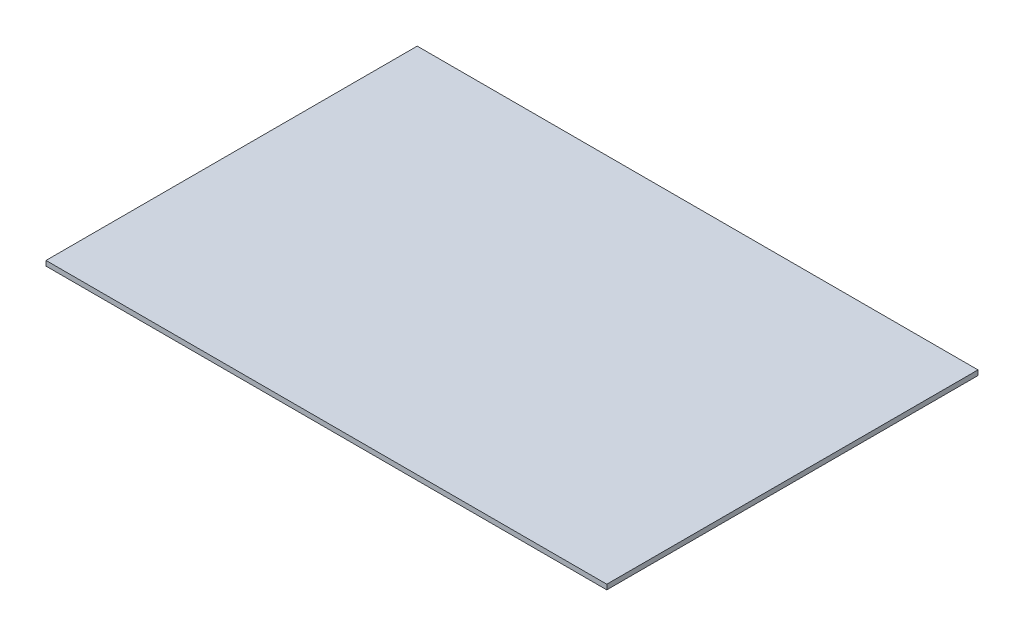
ISO-10303-21;
HEADER;
FILE_DESCRIPTION(('STEP AP214'),'2;1');
FILE_NAME('part.step','',(''),(''),'','','');
FILE_SCHEMA(('AUTOMOTIVE_DESIGN { 1 0 10303 214 1 1 1 1 }'));
ENDSEC;
DATA;
#1=APPLICATION_CONTEXT('core data for automotive mechanical design processes');
#2=APPLICATION_PROTOCOL_DEFINITION('international standard','automotive_design',2000,#1);
#3=PRODUCT_CONTEXT('',#1,'mechanical');
#4=PRODUCT('Part','Part','',(#3));
#5=PRODUCT_RELATED_PRODUCT_CATEGORY('part','',(#4));
#6=PRODUCT_DEFINITION_FORMATION('','',#4);
#7=PRODUCT_DEFINITION_CONTEXT('part definition',#1,'design');
#8=PRODUCT_DEFINITION('design','',#6,#7);
#9=PRODUCT_DEFINITION_SHAPE('','',#8);
#10=(LENGTH_UNIT() NAMED_UNIT(*) SI_UNIT(.MILLI.,.METRE.));
#11=(NAMED_UNIT(*) PLANE_ANGLE_UNIT() SI_UNIT($,.RADIAN.));
#12=(NAMED_UNIT(*) SI_UNIT($,.STERADIAN.) SOLID_ANGLE_UNIT());
#13=UNCERTAINTY_MEASURE_WITH_UNIT(LENGTH_MEASURE(1.E-05),#10,'distance_accuracy_value','');
#14=(GEOMETRIC_REPRESENTATION_CONTEXT(3) GLOBAL_UNCERTAINTY_ASSIGNED_CONTEXT((#13)) GLOBAL_UNIT_ASSIGNED_CONTEXT((#10,
#11,#12)) REPRESENTATION_CONTEXT('',''));
#15=CARTESIAN_POINT('',(0.,0.,0.));
#16=DIRECTION('',(0.,0.,1.));
#17=DIRECTION('',(1.,0.,0.));
#18=AXIS2_PLACEMENT_3D('',#15,#16,#17);
#19=CARTESIAN_POINT('',(0.,7.9375,0.));
#20=DIRECTION('',(1.,0.,0.));
#21=DIRECTION('',(0.,0.,-1.));
#22=AXIS2_PLACEMENT_3D('',#19,#20,#21);
#23=PLANE('',#22);
#24=DIRECTION('',(0.,0.,1.));
#25=VECTOR('',#24,1.);
#26=CARTESIAN_POINT('',(0.,0.,0.));
#27=LINE('',#26,#25);
#28=CARTESIAN_POINT('',(0.,0.,-596.9));
#29=VERTEX_POINT('',#28);
#30=CARTESIAN_POINT('',(0.,0.,0.));
#31=VERTEX_POINT('',#30);
#32=EDGE_CURVE('E97',#29,#31,#27,.T.);
#33=ORIENTED_EDGE('',*,*,#32,.T.);
#34=DIRECTION('',(0.,-1.,0.));
#35=VECTOR('',#34,1.);
#36=CARTESIAN_POINT('',(0.,7.9375,0.));
#37=LINE('',#36,#35);
#38=CARTESIAN_POINT('',(0.,7.9375,0.));
#39=VERTEX_POINT('',#38);
#40=EDGE_CURVE('E11',#39,#31,#37,.T.);
#41=ORIENTED_EDGE('',*,*,#40,.F.);
#42=DIRECTION('',(0.,0.,1.));
#43=VECTOR('',#42,1.);
#44=CARTESIAN_POINT('',(0.,7.9375,0.));
#45=LINE('',#44,#43);
#46=CARTESIAN_POINT('',(0.,7.9375,-596.9));
#47=VERTEX_POINT('',#46);
#48=EDGE_CURVE('E85',#47,#39,#45,.T.);
#49=ORIENTED_EDGE('',*,*,#48,.F.);
#50=DIRECTION('',(0.,-1.,0.));
#51=VECTOR('',#50,1.);
#52=CARTESIAN_POINT('',(0.,7.9375,-596.9));
#53=LINE('',#52,#51);
#54=EDGE_CURVE('E93',#47,#29,#53,.T.);
#55=ORIENTED_EDGE('',*,*,#54,.T.);
#56=EDGE_LOOP('',(#33,#41,#49,#55));
#57=FACE_BOUND('',#56,.T.);
#58=ADVANCED_FACE('F34',(#57),#23,.F.);
#59=CARTESIAN_POINT('',(0.,7.9375,0.));
#60=DIRECTION('',(0.,0.,-1.));
#61=DIRECTION('',(-1.,0.,0.));
#62=AXIS2_PLACEMENT_3D('',#59,#60,#61);
#63=PLANE('',#62);
#64=DIRECTION('',(1.,0.,0.));
#65=VECTOR('',#64,1.);
#66=CARTESIAN_POINT('',(0.,0.,0.));
#67=LINE('',#66,#65);
#68=CARTESIAN_POINT('',(901.7,0.,0.));
#69=VERTEX_POINT('',#68);
#70=EDGE_CURVE('E89',#31,#69,#67,.T.);
#71=ORIENTED_EDGE('',*,*,#70,.T.);
#72=DIRECTION('',(0.,-1.,0.));
#73=VECTOR('',#72,1.);
#74=CARTESIAN_POINT('',(901.7,7.9375,0.));
#75=LINE('',#74,#73);
#76=CARTESIAN_POINT('',(901.7,7.9375,0.));
#77=VERTEX_POINT('',#76);
#78=EDGE_CURVE('E42',#77,#69,#75,.T.);
#79=ORIENTED_EDGE('',*,*,#78,.F.);
#80=DIRECTION('',(1.,0.,0.));
#81=VECTOR('',#80,1.);
#82=CARTESIAN_POINT('',(0.,7.9375,0.));
#83=LINE('',#82,#81);
#84=EDGE_CURVE('E80',#39,#77,#83,.T.);
#85=ORIENTED_EDGE('',*,*,#84,.F.);
#86=ORIENTED_EDGE('',*,*,#40,.T.);
#87=EDGE_LOOP('',(#71,#79,#85,#86));
#88=FACE_BOUND('',#87,.T.);
#89=ADVANCED_FACE('F88',(#88),#63,.F.);
#90=CARTESIAN_POINT('',(901.7,7.9375,0.));
#91=DIRECTION('',(-1.,0.,0.));
#92=DIRECTION('',(0.,0.,1.));
#93=AXIS2_PLACEMENT_3D('',#90,#91,#92);
#94=PLANE('',#93);
#95=DIRECTION('',(0.,0.,-1.));
#96=VECTOR('',#95,1.);
#97=CARTESIAN_POINT('',(901.7,0.,0.));
#98=LINE('',#97,#96);
#99=CARTESIAN_POINT('',(901.7,0.,-596.9));
#100=VERTEX_POINT('',#99);
#101=EDGE_CURVE('E67',#69,#100,#98,.T.);
#102=ORIENTED_EDGE('',*,*,#101,.T.);
#103=DIRECTION('',(0.,-1.,0.));
#104=VECTOR('',#103,1.);
#105=CARTESIAN_POINT('',(901.7,7.9375,-596.9));
#106=LINE('',#105,#104);
#107=CARTESIAN_POINT('',(901.7,7.9375,-596.9));
#108=VERTEX_POINT('',#107);
#109=EDGE_CURVE('E90',#108,#100,#106,.T.);
#110=ORIENTED_EDGE('',*,*,#109,.F.);
#111=DIRECTION('',(0.,0.,-1.));
#112=VECTOR('',#111,1.);
#113=CARTESIAN_POINT('',(901.7,7.9375,0.));
#114=LINE('',#113,#112);
#115=EDGE_CURVE('E83',#77,#108,#114,.T.);
#116=ORIENTED_EDGE('',*,*,#115,.F.);
#117=ORIENTED_EDGE('',*,*,#78,.T.);
#118=EDGE_LOOP('',(#102,#110,#116,#117));
#119=FACE_BOUND('',#118,.T.);
#120=ADVANCED_FACE('F91',(#119),#94,.F.);
#121=CARTESIAN_POINT('',(0.,7.9375,-596.9));
#122=DIRECTION('',(0.,0.,1.));
#123=DIRECTION('',(1.,0.,0.));
#124=AXIS2_PLACEMENT_3D('',#121,#122,#123);
#125=PLANE('',#124);
#126=DIRECTION('',(-1.,0.,0.));
#127=VECTOR('',#126,1.);
#128=CARTESIAN_POINT('',(0.,0.,-596.9));
#129=LINE('',#128,#127);
#130=EDGE_CURVE('E73',#100,#29,#129,.T.);
#131=ORIENTED_EDGE('',*,*,#130,.T.);
#132=ORIENTED_EDGE('',*,*,#54,.F.);
#133=DIRECTION('',(-1.,0.,0.));
#134=VECTOR('',#133,1.);
#135=CARTESIAN_POINT('',(0.,7.9375,-596.9));
#136=LINE('',#135,#134);
#137=EDGE_CURVE('E50',#108,#47,#136,.T.);
#138=ORIENTED_EDGE('',*,*,#137,.F.);
#139=ORIENTED_EDGE('',*,*,#109,.T.);
#140=EDGE_LOOP('',(#131,#132,#138,#139));
#141=FACE_BOUND('',#140,.T.);
#142=ADVANCED_FACE('F104',(#141),#125,.F.);
#143=CARTESIAN_POINT('',(0.,7.9375,0.));
#144=DIRECTION('',(0.,-1.,0.));
#145=DIRECTION('',(0.,0.,-1.));
#146=AXIS2_PLACEMENT_3D('',#143,#144,#145);
#147=PLANE('',#146);
#148=ORIENTED_EDGE('',*,*,#48,.T.);
#149=ORIENTED_EDGE('',*,*,#84,.T.);
#150=ORIENTED_EDGE('',*,*,#115,.T.);
#151=ORIENTED_EDGE('',*,*,#137,.T.);
#152=EDGE_LOOP('',(#148,#149,#150,#151));
#153=FACE_BOUND('',#152,.T.);
#154=ADVANCED_FACE('F81',(#153),#147,.F.);
#155=CARTESIAN_POINT('',(0.,0.,0.));
#156=DIRECTION('',(0.,-1.,0.));
#157=DIRECTION('',(0.,0.,-1.));
#158=AXIS2_PLACEMENT_3D('',#155,#156,#157);
#159=PLANE('',#158);
#160=ORIENTED_EDGE('',*,*,#32,.F.);
#161=ORIENTED_EDGE('',*,*,#130,.F.);
#162=ORIENTED_EDGE('',*,*,#101,.F.);
#163=ORIENTED_EDGE('',*,*,#70,.F.);
#164=EDGE_LOOP('',(#160,#161,#162,#163));
#165=FACE_BOUND('',#164,.T.);
#166=ADVANCED_FACE('F107',(#165),#159,.T.);
#167=CLOSED_SHELL('',(#58,#89,#120,#142,#154,#166));
#168=MANIFOLD_SOLID_BREP('B2',#167);
#169=ADVANCED_BREP_SHAPE_REPRESENTATION('',(#18,#168),#14);
#170=SHAPE_DEFINITION_REPRESENTATION(#9,#169);
ENDSEC;
END-ISO-10303-21;
